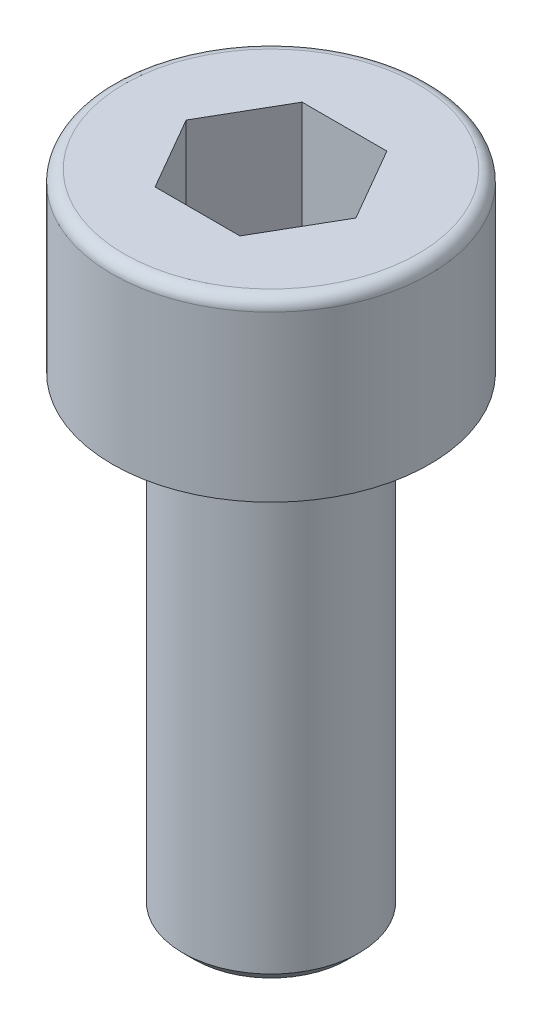
ISO-10303-21;
HEADER;
FILE_DESCRIPTION(('STEP AP214'),'2;1');
FILE_NAME('part.step','',(''),(''),'','','');
FILE_SCHEMA(('AUTOMOTIVE_DESIGN { 1 0 10303 214 1 1 1 1 }'));
ENDSEC;
DATA;
#1=APPLICATION_CONTEXT('core data for automotive mechanical design processes');
#2=APPLICATION_PROTOCOL_DEFINITION('international standard','automotive_design',2000,#1);
#3=PRODUCT_CONTEXT('',#1,'mechanical');
#4=PRODUCT('Part','Part','',(#3));
#5=PRODUCT_RELATED_PRODUCT_CATEGORY('part','',(#4));
#6=PRODUCT_DEFINITION_FORMATION('','',#4);
#7=PRODUCT_DEFINITION_CONTEXT('part definition',#1,'design');
#8=PRODUCT_DEFINITION('design','',#6,#7);
#9=PRODUCT_DEFINITION_SHAPE('','',#8);
#10=(LENGTH_UNIT() NAMED_UNIT(*) SI_UNIT(.MILLI.,.METRE.));
#11=(NAMED_UNIT(*) PLANE_ANGLE_UNIT() SI_UNIT($,.RADIAN.));
#12=(NAMED_UNIT(*) SI_UNIT($,.STERADIAN.) SOLID_ANGLE_UNIT());
#13=UNCERTAINTY_MEASURE_WITH_UNIT(LENGTH_MEASURE(1.E-05),#10,'distance_accuracy_value','');
#14=(GEOMETRIC_REPRESENTATION_CONTEXT(3) GLOBAL_UNCERTAINTY_ASSIGNED_CONTEXT((#13)) GLOBAL_UNIT_ASSIGNED_CONTEXT((#10,
#11,#12)) REPRESENTATION_CONTEXT('',''));
#15=CARTESIAN_POINT('',(0.,0.,0.));
#16=DIRECTION('',(0.,0.,1.));
#17=DIRECTION('',(1.,0.,0.));
#18=AXIS2_PLACEMENT_3D('',#15,#16,#17);
#19=CARTESIAN_POINT('',(0.,3.,-2.5));
#20=DIRECTION('',(0.,-1.,0.));
#21=DIRECTION('',(0.,0.,-1.));
#22=AXIS2_PLACEMENT_3D('',#19,#20,#21);
#23=PLANE('',#22);
#24=DIRECTION('',(-1.,0.,0.));
#25=VECTOR('',#24,1.);
#26=CARTESIAN_POINT('',(0.721687836487032,3.,-1.25));
#27=LINE('',#26,#25);
#28=CARTESIAN_POINT('',(0.721687836487032,3.,-1.25));
#29=VERTEX_POINT('',#28);
#30=CARTESIAN_POINT('',(-0.721687836487032,3.,-1.25));
#31=VERTEX_POINT('',#30);
#32=EDGE_CURVE('E122',#29,#31,#27,.T.);
#33=ORIENTED_EDGE('',*,*,#32,.F.);
#34=DIRECTION('',(-0.5,0.,-0.866025403784439));
#35=VECTOR('',#34,1.);
#36=CARTESIAN_POINT('',(1.44337567297406,3.,0.));
#37=LINE('',#36,#35);
#38=CARTESIAN_POINT('',(1.44337567297406,3.,0.));
#39=VERTEX_POINT('',#38);
#40=EDGE_CURVE('E48',#39,#29,#37,.T.);
#41=ORIENTED_EDGE('',*,*,#40,.F.);
#42=DIRECTION('',(0.5,0.,-0.866025403784438));
#43=VECTOR('',#42,1.);
#44=CARTESIAN_POINT('',(0.721687836487032,3.,1.25));
#45=LINE('',#44,#43);
#46=CARTESIAN_POINT('',(0.721687836487032,3.,1.25));
#47=VERTEX_POINT('',#46);
#48=EDGE_CURVE('E131',#47,#39,#45,.T.);
#49=ORIENTED_EDGE('',*,*,#48,.F.);
#50=DIRECTION('',(1.,0.,0.));
#51=VECTOR('',#50,1.);
#52=CARTESIAN_POINT('',(-0.721687836487032,3.,1.25));
#53=LINE('',#52,#51);
#54=CARTESIAN_POINT('',(-0.721687836487032,3.,1.25));
#55=VERTEX_POINT('',#54);
#56=EDGE_CURVE('E129',#55,#47,#53,.T.);
#57=ORIENTED_EDGE('',*,*,#56,.F.);
#58=DIRECTION('',(0.5,0.,0.866025403784439));
#59=VECTOR('',#58,1.);
#60=CARTESIAN_POINT('',(-1.44337567297406,3.,0.));
#61=LINE('',#60,#59);
#62=CARTESIAN_POINT('',(-1.44337567297406,3.,0.));
#63=VERTEX_POINT('',#62);
#64=EDGE_CURVE('E96',#63,#55,#61,.T.);
#65=ORIENTED_EDGE('',*,*,#64,.F.);
#66=DIRECTION('',(-0.5,0.,0.866025403784439));
#67=VECTOR('',#66,1.);
#68=CARTESIAN_POINT('',(-0.721687836487032,3.,-1.25));
#69=LINE('',#68,#67);
#70=EDGE_CURVE('E125',#31,#63,#69,.T.);
#71=ORIENTED_EDGE('',*,*,#70,.F.);
#72=EDGE_LOOP('',(#33,#41,#49,#57,#65,#71));
#73=FACE_BOUND('',#72,.T.);
#74=CARTESIAN_POINT('',(0.,3.,0.));
#75=DIRECTION('',(0.,1.,0.));
#76=DIRECTION('',(0.,0.,1.));
#77=AXIS2_PLACEMENT_3D('',#74,#75,#76);
#78=CIRCLE('',#77,2.5);
#79=CARTESIAN_POINT('',(0.,3.,2.5));
#80=VERTEX_POINT('',#79);
#81=EDGE_CURVE('E11',#80,#80,#78,.T.);
#82=ORIENTED_EDGE('',*,*,#81,.T.);
#83=EDGE_LOOP('',(#82));
#84=FACE_BOUND('',#83,.T.);
#85=ADVANCED_FACE('F34',(#73,#84),#23,.F.);
#86=CARTESIAN_POINT('',(0.,2.8,0.));
#87=DIRECTION('',(0.,1.,0.));
#88=DIRECTION('',(0.,0.,1.));
#89=AXIS2_PLACEMENT_3D('',#86,#87,#88);
#90=TOROIDAL_SURFACE('',#89,2.5,0.2);
#91=ORIENTED_EDGE('',*,*,#81,.F.);
#92=EDGE_LOOP('',(#91));
#93=FACE_BOUND('',#92,.T.);
#94=CARTESIAN_POINT('',(0.,2.8,0.));
#95=DIRECTION('',(0.,1.,0.));
#96=DIRECTION('',(0.,0.,1.));
#97=AXIS2_PLACEMENT_3D('',#94,#95,#96);
#98=CIRCLE('',#97,2.7);
#99=CARTESIAN_POINT('',(0.,2.8,2.7));
#100=VERTEX_POINT('',#99);
#101=EDGE_CURVE('E41',#100,#100,#98,.T.);
#102=ORIENTED_EDGE('',*,*,#101,.T.);
#103=EDGE_LOOP('',(#102));
#104=FACE_BOUND('',#103,.T.);
#105=ADVANCED_FACE('F157',(#93,#104),#90,.T.);
#106=CARTESIAN_POINT('',(0.,11.8274509803922,0.));
#107=DIRECTION('',(0.,1.,0.));
#108=DIRECTION('',(0.,0.,1.));
#109=AXIS2_PLACEMENT_3D('',#106,#107,#108);
#110=CYLINDRICAL_SURFACE('',#109,2.7);
#111=ORIENTED_EDGE('',*,*,#101,.F.);
#112=EDGE_LOOP('',(#111));
#113=FACE_BOUND('',#112,.T.);
#114=CARTESIAN_POINT('',(0.,0.,0.));
#115=DIRECTION('',(0.,1.,0.));
#116=DIRECTION('',(0.,0.,1.));
#117=AXIS2_PLACEMENT_3D('',#114,#115,#116);
#118=CIRCLE('',#117,2.7);
#119=CARTESIAN_POINT('',(0.,0.,2.7));
#120=VERTEX_POINT('',#119);
#121=EDGE_CURVE('E152',#120,#120,#118,.T.);
#122=ORIENTED_EDGE('',*,*,#121,.T.);
#123=EDGE_LOOP('',(#122));
#124=FACE_BOUND('',#123,.T.);
#125=ADVANCED_FACE('F159',(#113,#124),#110,.T.);
#126=CARTESIAN_POINT('',(0.,0.,-1.7));
#127=DIRECTION('',(0.,1.,0.));
#128=DIRECTION('',(0.,0.,1.));
#129=AXIS2_PLACEMENT_3D('',#126,#127,#128);
#130=PLANE('',#129);
#131=ORIENTED_EDGE('',*,*,#121,.F.);
#132=EDGE_LOOP('',(#131));
#133=FACE_BOUND('',#132,.T.);
#134=CARTESIAN_POINT('',(0.,0.,0.));
#135=DIRECTION('',(0.,1.,0.));
#136=DIRECTION('',(0.,0.,1.));
#137=AXIS2_PLACEMENT_3D('',#134,#135,#136);
#138=CIRCLE('',#137,1.7);
#139=CARTESIAN_POINT('',(0.,0.,1.7));
#140=VERTEX_POINT('',#139);
#141=EDGE_CURVE('E149',#140,#140,#138,.T.);
#142=ORIENTED_EDGE('',*,*,#141,.T.);
#143=EDGE_LOOP('',(#142));
#144=FACE_BOUND('',#143,.T.);
#145=ADVANCED_FACE('F162',(#133,#144),#130,.F.);
#146=CARTESIAN_POINT('',(0.,-0.2,0.));
#147=DIRECTION('',(0.,1.,0.));
#148=DIRECTION('',(0.,0.,1.));
#149=AXIS2_PLACEMENT_3D('',#146,#147,#148);
#150=TOROIDAL_SURFACE('',#149,1.7,0.2);
#151=ORIENTED_EDGE('',*,*,#141,.F.);
#152=EDGE_LOOP('',(#151));
#153=FACE_BOUND('',#152,.T.);
#154=CARTESIAN_POINT('',(0.,-0.199999999999999,0.));
#155=DIRECTION('',(0.,1.,0.));
#156=DIRECTION('',(0.,0.,1.));
#157=AXIS2_PLACEMENT_3D('',#154,#155,#156);
#158=CIRCLE('',#157,1.5);
#159=CARTESIAN_POINT('',(0.,-0.199999999999999,1.5));
#160=VERTEX_POINT('',#159);
#161=EDGE_CURVE('E146',#160,#160,#158,.T.);
#162=ORIENTED_EDGE('',*,*,#161,.T.);
#163=EDGE_LOOP('',(#162));
#164=FACE_BOUND('',#163,.T.);
#165=ADVANCED_FACE('F168',(#153,#164),#150,.F.);
#166=CARTESIAN_POINT('',(0.,11.8274509803922,0.));
#167=DIRECTION('',(0.,1.,0.));
#168=DIRECTION('',(0.,0.,1.));
#169=AXIS2_PLACEMENT_3D('',#166,#167,#168);
#170=CYLINDRICAL_SURFACE('',#169,1.5);
#171=ORIENTED_EDGE('',*,*,#161,.F.);
#172=EDGE_LOOP('',(#171));
#173=FACE_BOUND('',#172,.T.);
#174=CARTESIAN_POINT('',(0.,-7.8,0.));
#175=DIRECTION('',(0.,1.,0.));
#176=DIRECTION('',(0.,0.,1.));
#177=AXIS2_PLACEMENT_3D('',#174,#175,#176);
#178=CIRCLE('',#177,1.5);
#179=CARTESIAN_POINT('',(0.,-7.8,1.5));
#180=VERTEX_POINT('',#179);
#181=EDGE_CURVE('E143',#180,#180,#178,.T.);
#182=ORIENTED_EDGE('',*,*,#181,.T.);
#183=EDGE_LOOP('',(#182));
#184=FACE_BOUND('',#183,.T.);
#185=ADVANCED_FACE('F174',(#173,#184),#170,.T.);
#186=CARTESIAN_POINT('',(0.,-8.,0.));
#187=DIRECTION('',(0.,1.,0.));
#188=DIRECTION('',(0.,0.,1.));
#189=AXIS2_PLACEMENT_3D('',#186,#187,#188);
#190=CONICAL_SURFACE('',#189,1.3,0.785398163397448);
#191=ORIENTED_EDGE('',*,*,#181,.F.);
#192=EDGE_LOOP('',(#191));
#193=FACE_BOUND('',#192,.T.);
#194=CARTESIAN_POINT('',(0.,-8.,0.));
#195=DIRECTION('',(0.,1.,0.));
#196=DIRECTION('',(0.,0.,1.));
#197=AXIS2_PLACEMENT_3D('',#194,#195,#196);
#198=CIRCLE('',#197,1.3);
#199=CARTESIAN_POINT('',(0.,-8.,1.3));
#200=VERTEX_POINT('',#199);
#201=EDGE_CURVE('E135',#200,#200,#198,.T.);
#202=ORIENTED_EDGE('',*,*,#201,.T.);
#203=EDGE_LOOP('',(#202));
#204=FACE_BOUND('',#203,.T.);
#205=ADVANCED_FACE('F180',(#193,#204),#190,.T.);
#206=CARTESIAN_POINT('',(0.,-8.,0.));
#207=DIRECTION('',(0.,1.,0.));
#208=DIRECTION('',(0.,0.,1.));
#209=AXIS2_PLACEMENT_3D('',#206,#207,#208);
#210=PLANE('',#209);
#211=ORIENTED_EDGE('',*,*,#201,.F.);
#212=EDGE_LOOP('',(#211));
#213=FACE_BOUND('',#212,.T.);
#214=ADVANCED_FACE('F186',(#213),#210,.F.);
#215=CARTESIAN_POINT('',(1.44337567297406,1.,0.));
#216=DIRECTION('',(0.866025403784439,0.,-0.5));
#217=DIRECTION('',(-0.5,0.,-0.866025403784439));
#218=AXIS2_PLACEMENT_3D('',#215,#216,#217);
#219=PLANE('',#218);
#220=ORIENTED_EDGE('',*,*,#40,.T.);
#221=DIRECTION('',(0.,1.,0.));
#222=VECTOR('',#221,1.);
#223=CARTESIAN_POINT('',(0.721687836487032,1.,-1.25));
#224=LINE('',#223,#222);
#225=CARTESIAN_POINT('',(0.721687836487032,1.,-1.25));
#226=VERTEX_POINT('',#225);
#227=EDGE_CURVE('E78',#226,#29,#224,.T.);
#228=ORIENTED_EDGE('',*,*,#227,.F.);
#229=DIRECTION('',(-0.5,0.,-0.866025403784439));
#230=VECTOR('',#229,1.);
#231=CARTESIAN_POINT('',(1.44337567297406,1.,0.));
#232=LINE('',#231,#230);
#233=CARTESIAN_POINT('',(1.44337567297406,1.,0.));
#234=VERTEX_POINT('',#233);
#235=EDGE_CURVE('E133',#234,#226,#232,.T.);
#236=ORIENTED_EDGE('',*,*,#235,.F.);
#237=DIRECTION('',(0.,1.,0.));
#238=VECTOR('',#237,1.);
#239=CARTESIAN_POINT('',(1.44337567297406,1.,0.));
#240=LINE('',#239,#238);
#241=EDGE_CURVE('E56',#234,#39,#240,.T.);
#242=ORIENTED_EDGE('',*,*,#241,.T.);
#243=EDGE_LOOP('',(#220,#228,#236,#242));
#244=FACE_BOUND('',#243,.T.);
#245=ADVANCED_FACE('F191',(#244),#219,.F.);
#246=CARTESIAN_POINT('',(0.721687836487032,1.,1.25));
#247=DIRECTION('',(0.866025403784438,0.,0.5));
#248=DIRECTION('',(0.5,0.,-0.866025403784439));
#249=AXIS2_PLACEMENT_3D('',#246,#247,#248);
#250=PLANE('',#249);
#251=ORIENTED_EDGE('',*,*,#48,.T.);
#252=ORIENTED_EDGE('',*,*,#241,.F.);
#253=DIRECTION('',(0.5,0.,-0.866025403784438));
#254=VECTOR('',#253,1.);
#255=CARTESIAN_POINT('',(0.721687836487032,1.,1.25));
#256=LINE('',#255,#254);
#257=CARTESIAN_POINT('',(0.721687836487032,1.,1.25));
#258=VERTEX_POINT('',#257);
#259=EDGE_CURVE('E108',#258,#234,#256,.T.);
#260=ORIENTED_EDGE('',*,*,#259,.F.);
#261=DIRECTION('',(0.,1.,0.));
#262=VECTOR('',#261,1.);
#263=CARTESIAN_POINT('',(0.721687836487032,1.,1.25));
#264=LINE('',#263,#262);
#265=EDGE_CURVE('E100',#258,#47,#264,.T.);
#266=ORIENTED_EDGE('',*,*,#265,.T.);
#267=EDGE_LOOP('',(#251,#252,#260,#266));
#268=FACE_BOUND('',#267,.T.);
#269=ADVANCED_FACE('F196',(#268),#250,.F.);
#270=CARTESIAN_POINT('',(-0.721687836487032,1.,1.25));
#271=DIRECTION('',(0.,0.,1.));
#272=DIRECTION('',(1.,0.,0.));
#273=AXIS2_PLACEMENT_3D('',#270,#271,#272);
#274=PLANE('',#273);
#275=ORIENTED_EDGE('',*,*,#56,.T.);
#276=ORIENTED_EDGE('',*,*,#265,.F.);
#277=DIRECTION('',(1.,0.,0.));
#278=VECTOR('',#277,1.);
#279=CARTESIAN_POINT('',(-0.721687836487032,1.,1.25));
#280=LINE('',#279,#278);
#281=CARTESIAN_POINT('',(-0.721687836487032,1.,1.25));
#282=VERTEX_POINT('',#281);
#283=EDGE_CURVE('E104',#282,#258,#280,.T.);
#284=ORIENTED_EDGE('',*,*,#283,.F.);
#285=DIRECTION('',(0.,1.,0.));
#286=VECTOR('',#285,1.);
#287=CARTESIAN_POINT('',(-0.721687836487032,1.,1.25));
#288=LINE('',#287,#286);
#289=EDGE_CURVE('E89',#282,#55,#288,.T.);
#290=ORIENTED_EDGE('',*,*,#289,.T.);
#291=EDGE_LOOP('',(#275,#276,#284,#290));
#292=FACE_BOUND('',#291,.T.);
#293=ADVANCED_FACE('F105',(#292),#274,.F.);
#294=CARTESIAN_POINT('',(-1.44337567297406,1.,0.));
#295=DIRECTION('',(-0.866025403784439,0.,0.5));
#296=DIRECTION('',(0.5,0.,0.866025403784439));
#297=AXIS2_PLACEMENT_3D('',#294,#295,#296);
#298=PLANE('',#297);
#299=ORIENTED_EDGE('',*,*,#64,.T.);
#300=ORIENTED_EDGE('',*,*,#289,.F.);
#301=DIRECTION('',(0.5,0.,0.866025403784439));
#302=VECTOR('',#301,1.);
#303=CARTESIAN_POINT('',(-1.44337567297406,1.,0.));
#304=LINE('',#303,#302);
#305=CARTESIAN_POINT('',(-1.44337567297406,1.,0.));
#306=VERTEX_POINT('',#305);
#307=EDGE_CURVE('E93',#306,#282,#304,.T.);
#308=ORIENTED_EDGE('',*,*,#307,.F.);
#309=DIRECTION('',(0.,1.,0.));
#310=VECTOR('',#309,1.);
#311=CARTESIAN_POINT('',(-1.44337567297406,1.,0.));
#312=LINE('',#311,#310);
#313=EDGE_CURVE('E101',#306,#63,#312,.T.);
#314=ORIENTED_EDGE('',*,*,#313,.T.);
#315=EDGE_LOOP('',(#299,#300,#308,#314));
#316=FACE_BOUND('',#315,.T.);
#317=ADVANCED_FACE('F91',(#316),#298,.F.);
#318=CARTESIAN_POINT('',(-0.721687836487032,1.,-1.25));
#319=DIRECTION('',(-0.866025403784439,0.,-0.5));
#320=DIRECTION('',(-0.5,0.,0.866025403784439));
#321=AXIS2_PLACEMENT_3D('',#318,#319,#320);
#322=PLANE('',#321);
#323=ORIENTED_EDGE('',*,*,#70,.T.);
#324=ORIENTED_EDGE('',*,*,#313,.F.);
#325=DIRECTION('',(-0.5,0.,0.866025403784439));
#326=VECTOR('',#325,1.);
#327=CARTESIAN_POINT('',(-0.721687836487032,1.,-1.25));
#328=LINE('',#327,#326);
#329=CARTESIAN_POINT('',(-0.721687836487032,1.,-1.25));
#330=VERTEX_POINT('',#329);
#331=EDGE_CURVE('E114',#330,#306,#328,.T.);
#332=ORIENTED_EDGE('',*,*,#331,.F.);
#333=DIRECTION('',(0.,1.,0.));
#334=VECTOR('',#333,1.);
#335=CARTESIAN_POINT('',(-0.721687836487032,1.,-1.25));
#336=LINE('',#335,#334);
#337=EDGE_CURVE('E138',#330,#31,#336,.T.);
#338=ORIENTED_EDGE('',*,*,#337,.T.);
#339=EDGE_LOOP('',(#323,#324,#332,#338));
#340=FACE_BOUND('',#339,.T.);
#341=ADVANCED_FACE('F222',(#340),#322,.F.);
#342=CARTESIAN_POINT('',(0.721687836487032,1.,-1.25));
#343=DIRECTION('',(0.,0.,-1.));
#344=DIRECTION('',(-1.,0.,0.));
#345=AXIS2_PLACEMENT_3D('',#342,#343,#344);
#346=PLANE('',#345);
#347=ORIENTED_EDGE('',*,*,#32,.T.);
#348=ORIENTED_EDGE('',*,*,#337,.F.);
#349=DIRECTION('',(-1.,0.,0.));
#350=VECTOR('',#349,1.);
#351=CARTESIAN_POINT('',(0.721687836487032,1.,-1.25));
#352=LINE('',#351,#350);
#353=EDGE_CURVE('E116',#226,#330,#352,.T.);
#354=ORIENTED_EDGE('',*,*,#353,.F.);
#355=ORIENTED_EDGE('',*,*,#227,.T.);
#356=EDGE_LOOP('',(#347,#348,#354,#355));
#357=FACE_BOUND('',#356,.T.);
#358=ADVANCED_FACE('F210',(#357),#346,.F.);
#359=CARTESIAN_POINT('',(0.,1.,0.));
#360=DIRECTION('',(0.,1.,0.));
#361=DIRECTION('',(0.,0.,1.));
#362=AXIS2_PLACEMENT_3D('',#359,#360,#361);
#363=PLANE('',#362);
#364=ORIENTED_EDGE('',*,*,#235,.T.);
#365=ORIENTED_EDGE('',*,*,#353,.T.);
#366=ORIENTED_EDGE('',*,*,#331,.T.);
#367=ORIENTED_EDGE('',*,*,#307,.T.);
#368=ORIENTED_EDGE('',*,*,#283,.T.);
#369=ORIENTED_EDGE('',*,*,#259,.T.);
#370=EDGE_LOOP('',(#364,#365,#366,#367,#368,#369));
#371=FACE_BOUND('',#370,.T.);
#372=ADVANCED_FACE('F111',(#371),#363,.T.);
#373=CLOSED_SHELL('',(#85,#105,#125,#145,#165,#185,#205,#214,#245,#269,#293,#317,#341,#358,#372));
#374=MANIFOLD_SOLID_BREP('B2',#373);
#375=ADVANCED_BREP_SHAPE_REPRESENTATION('',(#18,#374),#14);
#376=SHAPE_DEFINITION_REPRESENTATION(#9,#375);
ENDSEC;
END-ISO-10303-21;
